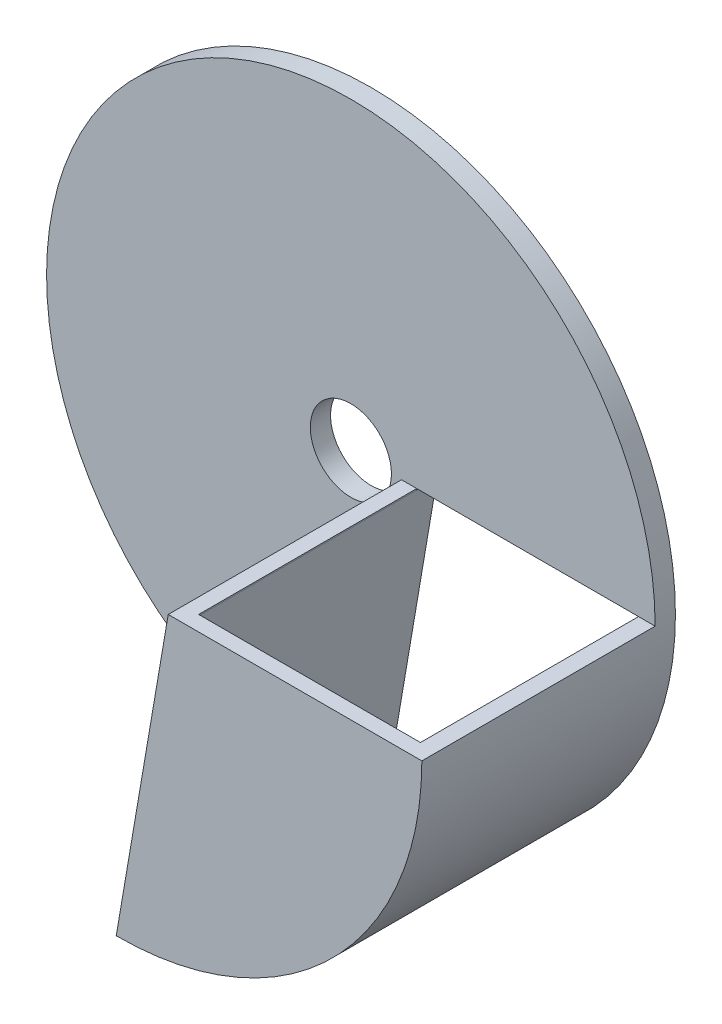
ISO-10303-21;
HEADER;
FILE_DESCRIPTION(('STEP AP214'),'2;1');
FILE_NAME('part.step','',(''),(''),'','','');
FILE_SCHEMA(('AUTOMOTIVE_DESIGN { 1 0 10303 214 1 1 1 1 }'));
ENDSEC;
DATA;
#1=APPLICATION_CONTEXT('core data for automotive mechanical design processes');
#2=APPLICATION_PROTOCOL_DEFINITION('international standard','automotive_design',2000,#1);
#3=PRODUCT_CONTEXT('',#1,'mechanical');
#4=PRODUCT('Part','Part','',(#3));
#5=PRODUCT_RELATED_PRODUCT_CATEGORY('part','',(#4));
#6=PRODUCT_DEFINITION_FORMATION('','',#4);
#7=PRODUCT_DEFINITION_CONTEXT('part definition',#1,'design');
#8=PRODUCT_DEFINITION('design','',#6,#7);
#9=PRODUCT_DEFINITION_SHAPE('','',#8);
#10=(LENGTH_UNIT() NAMED_UNIT(*) SI_UNIT(.MILLI.,.METRE.));
#11=(NAMED_UNIT(*) PLANE_ANGLE_UNIT() SI_UNIT($,.RADIAN.));
#12=(NAMED_UNIT(*) SI_UNIT($,.STERADIAN.) SOLID_ANGLE_UNIT());
#13=UNCERTAINTY_MEASURE_WITH_UNIT(LENGTH_MEASURE(1.E-05),#10,'distance_accuracy_value','');
#14=(GEOMETRIC_REPRESENTATION_CONTEXT(3) GLOBAL_UNCERTAINTY_ASSIGNED_CONTEXT((#13)) GLOBAL_UNIT_ASSIGNED_CONTEXT((#10,
#11,#12)) REPRESENTATION_CONTEXT('',''));
#15=CARTESIAN_POINT('',(0.,0.,0.));
#16=DIRECTION('',(0.,0.,1.));
#17=DIRECTION('',(1.,0.,0.));
#18=AXIS2_PLACEMENT_3D('',#15,#16,#17);
#19=CARTESIAN_POINT('',(60.,0.,50.));
#20=DIRECTION('',(0.,-1.,0.));
#21=DIRECTION('',(1.,0.,0.));
#22=AXIS2_PLACEMENT_3D('',#19,#20,#21);
#23=PLANE('',#22);
#24=DIRECTION('',(-1.,0.,0.));
#25=VECTOR('',#24,1.);
#26=CARTESIAN_POINT('',(0.,0.,4.));
#27=LINE('',#26,#25);
#28=CARTESIAN_POINT('',(60.,0.,4.));
#29=VERTEX_POINT('',#28);
#30=CARTESIAN_POINT('',(56.7219328544349,0.,4.));
#31=VERTEX_POINT('',#30);
#32=EDGE_CURVE('E204',#29,#31,#27,.T.);
#33=ORIENTED_EDGE('',*,*,#32,.T.);
#34=DIRECTION('',(0.,0.,-1.));
#35=VECTOR('',#34,1.);
#36=CARTESIAN_POINT('',(56.7219328544349,0.,47.));
#37=LINE('',#36,#35);
#38=CARTESIAN_POINT('',(56.7219328544349,0.,47.));
#39=VERTEX_POINT('',#38);
#40=EDGE_CURVE('E130',#39,#31,#37,.T.);
#41=ORIENTED_EDGE('',*,*,#40,.F.);
#42=DIRECTION('',(-1.,0.,0.));
#43=VECTOR('',#42,1.);
#44=CARTESIAN_POINT('',(0.,0.,47.));
#45=LINE('',#44,#43);
#46=CARTESIAN_POINT('',(12.9908595750254,0.,47.));
#47=VERTEX_POINT('',#46);
#48=EDGE_CURVE('E170',#39,#47,#45,.T.);
#49=ORIENTED_EDGE('',*,*,#48,.T.);
#50=DIRECTION('',(0.,0.,-1.));
#51=VECTOR('',#50,1.);
#52=CARTESIAN_POINT('',(12.9908595750254,0.,47.));
#53=LINE('',#52,#51);
#54=CARTESIAN_POINT('',(12.9908595750254,0.,4.));
#55=VERTEX_POINT('',#54);
#56=EDGE_CURVE('E142',#47,#55,#53,.T.);
#57=ORIENTED_EDGE('',*,*,#56,.T.);
#58=CARTESIAN_POINT('',(9.99085957502538,0.,4.));
#59=VERTEX_POINT('',#58);
#60=EDGE_CURVE('E208',#55,#59,#27,.T.);
#61=ORIENTED_EDGE('',*,*,#60,.T.);
#62=DIRECTION('',(0.,0.,-1.));
#63=VECTOR('',#62,1.);
#64=CARTESIAN_POINT('',(9.99085957502538,0.,50.));
#65=LINE('',#64,#63);
#66=CARTESIAN_POINT('',(9.99085957502538,0.,50.));
#67=VERTEX_POINT('',#66);
#68=EDGE_CURVE('E200',#67,#59,#65,.T.);
#69=ORIENTED_EDGE('',*,*,#68,.F.);
#70=DIRECTION('',(-1.,0.,0.));
#71=VECTOR('',#70,1.);
#72=CARTESIAN_POINT('',(60.,0.,50.));
#73=LINE('',#72,#71);
#74=CARTESIAN_POINT('',(60.,0.,50.));
#75=VERTEX_POINT('',#74);
#76=EDGE_CURVE('E187',#75,#67,#73,.T.);
#77=ORIENTED_EDGE('',*,*,#76,.F.);
#78=DIRECTION('',(0.,0.,-1.));
#79=VECTOR('',#78,1.);
#80=CARTESIAN_POINT('',(60.,0.,50.));
#81=LINE('',#80,#79);
#82=EDGE_CURVE('E194',#75,#29,#81,.T.);
#83=ORIENTED_EDGE('',*,*,#82,.T.);
#84=EDGE_LOOP('',(#33,#41,#49,#57,#61,#69,#77,#83));
#85=FACE_BOUND('',#84,.T.);
#86=ADVANCED_FACE('F39',(#85),#23,.F.);
#87=CARTESIAN_POINT('',(12.6645065777973,-2.16422529244381,47.));
#88=DIRECTION('',(0.985710687117101,-0.16844714691301,0.));
#89=DIRECTION('',(0.16844714691301,0.985710687117101,0.));
#90=AXIS2_PLACEMENT_3D('',#87,#88,#89);
#91=PLANE('',#90);
#92=DIRECTION('',(0.16844714691301,0.985710687117101,0.));
#93=VECTOR('',#92,1.);
#94=CARTESIAN_POINT('',(12.6645065777973,-2.16422529244381,4.));
#95=LINE('',#94,#93);
#96=CARTESIAN_POINT('',(12.9908595750254,-0.254488956532123,4.));
#97=VERTEX_POINT('',#96);
#98=CARTESIAN_POINT('',(13.0343489469161,0.,4.));
#99=VERTEX_POINT('',#98);
#100=EDGE_CURVE('E161',#97,#99,#95,.T.);
#101=ORIENTED_EDGE('',*,*,#100,.F.);
#102=DIRECTION('',(0.,0.,1.));
#103=VECTOR('',#102,1.);
#104=CARTESIAN_POINT('',(12.9908595750254,-0.254488956532127,47.));
#105=LINE('',#104,#103);
#106=CARTESIAN_POINT('',(12.9908595750254,-0.254488956532127,47.));
#107=VERTEX_POINT('',#106);
#108=EDGE_CURVE('E157',#97,#107,#105,.T.);
#109=ORIENTED_EDGE('',*,*,#108,.T.);
#110=DIRECTION('',(-0.16844714691301,-0.985710687117101,0.));
#111=VECTOR('',#110,1.);
#112=CARTESIAN_POINT('',(12.6645065777973,-2.16422529244381,47.));
#113=LINE('',#112,#111);
#114=CARTESIAN_POINT('',(3.32768339956714,-56.8009856007498,47.));
#115=VERTEX_POINT('',#114);
#116=EDGE_CURVE('E164',#107,#115,#113,.T.);
#117=ORIENTED_EDGE('',*,*,#116,.T.);
#118=DIRECTION('',(0.,0.,-1.));
#119=VECTOR('',#118,1.);
#120=CARTESIAN_POINT('',(3.32768339956714,-56.8009856007498,47.));
#121=LINE('',#120,#119);
#122=CARTESIAN_POINT('',(3.32768339956714,-56.8009856007498,0.));
#123=VERTEX_POINT('',#122);
#124=EDGE_CURVE('E184',#115,#123,#121,.T.);
#125=ORIENTED_EDGE('',*,*,#124,.T.);
#126=DIRECTION('',(-0.16844714691301,-0.985710687117101,0.));
#127=VECTOR('',#126,1.);
#128=CARTESIAN_POINT('',(12.6645065777973,-2.16422529244381,0.));
#129=LINE('',#128,#127);
#130=CARTESIAN_POINT('',(13.0343489469161,0.,0.));
#131=VERTEX_POINT('',#130);
#132=EDGE_CURVE('E163',#131,#123,#129,.T.);
#133=ORIENTED_EDGE('',*,*,#132,.F.);
#134=DIRECTION('',(0.,0.,-1.));
#135=VECTOR('',#134,1.);
#136=CARTESIAN_POINT('',(13.0343489469161,0.,47.));
#137=LINE('',#136,#135);
#138=EDGE_CURVE('E172',#99,#131,#137,.T.);
#139=ORIENTED_EDGE('',*,*,#138,.F.);
#140=EDGE_LOOP('',(#101,#109,#117,#125,#133,#139));
#141=FACE_BOUND('',#140,.T.);
#142=ADVANCED_FACE('F228',(#141),#91,.T.);
#143=CARTESIAN_POINT('',(0.,0.,0.));
#144=DIRECTION('',(0.,0.,1.));
#145=DIRECTION('',(1.,0.,0.));
#146=AXIS2_PLACEMENT_3D('',#143,#144,#145);
#147=PLANE('',#146);
#148=CARTESIAN_POINT('',(0.,0.,0.));
#149=DIRECTION('',(0.,0.,1.));
#150=DIRECTION('',(1.,0.,0.));
#151=AXIS2_PLACEMENT_3D('',#148,#149,#150);
#152=CIRCLE('',#151,8.);
#153=CARTESIAN_POINT('',(8.,0.,0.));
#154=VERTEX_POINT('',#153);
#155=EDGE_CURVE('E203',#154,#154,#152,.T.);
#156=ORIENTED_EDGE('',*,*,#155,.T.);
#157=EDGE_LOOP('',(#156));
#158=FACE_BOUND('',#157,.T.);
#159=CARTESIAN_POINT('',(0.,0.,0.));
#160=DIRECTION('',(0.,0.,1.));
#161=DIRECTION('',(1.,0.,0.));
#162=AXIS2_PLACEMENT_3D('',#159,#160,#161);
#163=CIRCLE('',#162,60.);
#164=CARTESIAN_POINT('',(60.,0.,0.));
#165=VERTEX_POINT('',#164);
#166=EDGE_CURVE('E43',#165,#165,#163,.T.);
#167=ORIENTED_EDGE('',*,*,#166,.F.);
#168=EDGE_LOOP('',(#167));
#169=FACE_BOUND('',#168,.T.);
#170=ORIENTED_EDGE('',*,*,#132,.T.);
#171=CARTESIAN_POINT('',(-0.199878192961273,0.000384746482229303,0.));
#172=DIRECTION('',(0.,0.,1.));
#173=DIRECTION('',(1.,0.,0.));
#174=AXIS2_PLACEMENT_3D('',#171,#172,#173);
#175=CIRCLE('',#174,56.9108018227866);
#176=CARTESIAN_POINT('',(56.7109236285248,0.,0.));
#177=VERTEX_POINT('',#176);
#178=EDGE_CURVE('E175',#123,#177,#175,.T.);
#179=ORIENTED_EDGE('',*,*,#178,.T.);
#180=DIRECTION('',(-1.,0.,0.));
#181=VECTOR('',#180,1.);
#182=CARTESIAN_POINT('',(0.,0.,0.));
#183=LINE('',#182,#181);
#184=EDGE_CURVE('E167',#177,#131,#183,.T.);
#185=ORIENTED_EDGE('',*,*,#184,.T.);
#186=EDGE_LOOP('',(#170,#179,#185));
#187=FACE_BOUND('',#186,.T.);
#188=ADVANCED_FACE('F231',(#158,#169,#187),#147,.F.);
#189=CARTESIAN_POINT('',(0.,0.,4.));
#190=DIRECTION('',(0.,0.,1.));
#191=DIRECTION('',(1.,0.,0.));
#192=AXIS2_PLACEMENT_3D('',#189,#190,#191);
#193=PLANE('',#192);
#194=CARTESIAN_POINT('',(0.,0.,4.));
#195=DIRECTION('',(0.,0.,1.));
#196=DIRECTION('',(1.,0.,0.));
#197=AXIS2_PLACEMENT_3D('',#194,#195,#196);
#198=CIRCLE('',#197,8.);
#199=CARTESIAN_POINT('',(8.,0.,4.));
#200=VERTEX_POINT('',#199);
#201=EDGE_CURVE('E48',#200,#200,#198,.T.);
#202=ORIENTED_EDGE('',*,*,#201,.F.);
#203=EDGE_LOOP('',(#202));
#204=FACE_BOUND('',#203,.T.);
#205=ORIENTED_EDGE('',*,*,#32,.F.);
#206=CARTESIAN_POINT('',(0.,0.,4.));
#207=DIRECTION('',(0.,0.,1.));
#208=DIRECTION('',(1.,0.,0.));
#209=AXIS2_PLACEMENT_3D('',#206,#207,#208);
#210=CIRCLE('',#209,60.);
#211=CARTESIAN_POINT('',(-0.262384410320105,-59.9994262841006,4.));
#212=VERTEX_POINT('',#211);
#213=EDGE_CURVE('E11',#29,#212,#210,.T.);
#214=ORIENTED_EDGE('',*,*,#213,.T.);
#215=DIRECTION('',(-0.16844714691301,-0.985710687117101,0.));
#216=VECTOR('',#215,1.);
#217=CARTESIAN_POINT('',(9.70737451644598,-1.65888385170478,4.));
#218=LINE('',#217,#216);
#219=EDGE_CURVE('E206',#59,#212,#218,.T.);
#220=ORIENTED_EDGE('',*,*,#219,.F.);
#221=ORIENTED_EDGE('',*,*,#60,.F.);
#222=DIRECTION('',(0.,1.,0.));
#223=VECTOR('',#222,1.);
#224=CARTESIAN_POINT('',(12.9908595750254,-3.,4.));
#225=LINE('',#224,#223);
#226=EDGE_CURVE('E56',#97,#55,#225,.T.);
#227=ORIENTED_EDGE('',*,*,#226,.F.);
#228=ORIENTED_EDGE('',*,*,#100,.T.);
#229=CARTESIAN_POINT('',(56.7109236285248,0.,4.));
#230=VERTEX_POINT('',#229);
#231=EDGE_CURVE('E207',#230,#99,#27,.T.);
#232=ORIENTED_EDGE('',*,*,#231,.F.);
#233=CARTESIAN_POINT('',(-0.199878192961273,0.000384746482229303,4.));
#234=DIRECTION('',(0.,0.,-1.));
#235=DIRECTION('',(-1.,0.,0.));
#236=AXIS2_PLACEMENT_3D('',#233,#234,#235);
#237=CIRCLE('',#236,56.9108018227866);
#238=CARTESIAN_POINT('',(56.6317772068735,-2.99999999999999,4.));
#239=VERTEX_POINT('',#238);
#240=EDGE_CURVE('E136',#230,#239,#237,.T.);
#241=ORIENTED_EDGE('',*,*,#240,.T.);
#242=DIRECTION('',(-1.,0.,0.));
#243=VECTOR('',#242,1.);
#244=CARTESIAN_POINT('',(56.7219328544349,-2.99999999999999,4.));
#245=LINE('',#244,#243);
#246=CARTESIAN_POINT('',(56.7219328544349,-2.99999999999999,4.));
#247=VERTEX_POINT('',#246);
#248=EDGE_CURVE('E64',#247,#239,#245,.T.);
#249=ORIENTED_EDGE('',*,*,#248,.F.);
#250=DIRECTION('',(0.,1.,0.));
#251=VECTOR('',#250,1.);
#252=CARTESIAN_POINT('',(56.7219328544349,-2.99999999999999,4.));
#253=LINE('',#252,#251);
#254=EDGE_CURVE('E125',#247,#31,#253,.T.);
#255=ORIENTED_EDGE('',*,*,#254,.T.);
#256=EDGE_LOOP('',(#205,#214,#220,#221,#227,#228,#232,#241,#249,#255));
#257=FACE_BOUND('',#256,.T.);
#258=ADVANCED_FACE('F134',(#204,#257),#193,.T.);
#259=CARTESIAN_POINT('',(0.,0.,4.));
#260=DIRECTION('',(0.,0.,-1.));
#261=DIRECTION('',(-1.,0.,0.));
#262=AXIS2_PLACEMENT_3D('',#259,#260,#261);
#263=CYLINDRICAL_SURFACE('',#262,8.);
#264=ORIENTED_EDGE('',*,*,#201,.T.);
#265=EDGE_LOOP('',(#264));
#266=FACE_BOUND('',#265,.T.);
#267=ORIENTED_EDGE('',*,*,#155,.F.);
#268=EDGE_LOOP('',(#267));
#269=FACE_BOUND('',#268,.T.);
#270=ADVANCED_FACE('F41',(#266,#269),#263,.F.);
#271=CARTESIAN_POINT('',(0.,0.,4.));
#272=DIRECTION('',(0.,0.,-1.));
#273=DIRECTION('',(-1.,0.,0.));
#274=AXIS2_PLACEMENT_3D('',#271,#272,#273);
#275=CYLINDRICAL_SURFACE('',#274,60.);
#276=ORIENTED_EDGE('',*,*,#213,.F.);
#277=ORIENTED_EDGE('',*,*,#82,.F.);
#278=CARTESIAN_POINT('',(0.,0.,50.));
#279=DIRECTION('',(0.,0.,1.));
#280=DIRECTION('',(1.,0.,0.));
#281=AXIS2_PLACEMENT_3D('',#278,#279,#280);
#282=CIRCLE('',#281,60.);
#283=CARTESIAN_POINT('',(-0.262384410320105,-59.9994262841006,50.));
#284=VERTEX_POINT('',#283);
#285=EDGE_CURVE('E192',#284,#75,#282,.T.);
#286=ORIENTED_EDGE('',*,*,#285,.F.);
#287=DIRECTION('',(0.,0.,-1.));
#288=VECTOR('',#287,1.);
#289=CARTESIAN_POINT('',(-0.262384410320105,-59.9994262841006,50.));
#290=LINE('',#289,#288);
#291=EDGE_CURVE('E197',#284,#212,#290,.T.);
#292=ORIENTED_EDGE('',*,*,#291,.T.);
#293=EDGE_LOOP('',(#276,#277,#286,#292));
#294=FACE_BOUND('',#293,.T.);
#295=ORIENTED_EDGE('',*,*,#166,.T.);
#296=EDGE_LOOP('',(#295));
#297=FACE_BOUND('',#296,.T.);
#298=ADVANCED_FACE('F242',(#294,#297),#275,.T.);
#299=CARTESIAN_POINT('',(9.99085957502538,0.,50.));
#300=DIRECTION('',(0.985710687117101,-0.16844714691301,0.));
#301=DIRECTION('',(0.16844714691301,0.985710687117101,0.));
#302=AXIS2_PLACEMENT_3D('',#299,#300,#301);
#303=PLANE('',#302);
#304=ORIENTED_EDGE('',*,*,#219,.T.);
#305=ORIENTED_EDGE('',*,*,#291,.F.);
#306=DIRECTION('',(-0.16844714691301,-0.985710687117101,0.));
#307=VECTOR('',#306,1.);
#308=CARTESIAN_POINT('',(9.99085957502538,0.,50.));
#309=LINE('',#308,#307);
#310=EDGE_CURVE('E190',#67,#284,#309,.T.);
#311=ORIENTED_EDGE('',*,*,#310,.F.);
#312=ORIENTED_EDGE('',*,*,#68,.T.);
#313=EDGE_LOOP('',(#304,#305,#311,#312));
#314=FACE_BOUND('',#313,.T.);
#315=ADVANCED_FACE('F246',(#314),#303,.F.);
#316=CARTESIAN_POINT('',(0.,0.,50.));
#317=DIRECTION('',(0.,0.,1.));
#318=DIRECTION('',(1.,0.,0.));
#319=AXIS2_PLACEMENT_3D('',#316,#317,#318);
#320=PLANE('',#319);
#321=ORIENTED_EDGE('',*,*,#76,.T.);
#322=ORIENTED_EDGE('',*,*,#310,.T.);
#323=ORIENTED_EDGE('',*,*,#285,.T.);
#324=EDGE_LOOP('',(#321,#322,#323));
#325=FACE_BOUND('',#324,.T.);
#326=ADVANCED_FACE('F248',(#325),#320,.T.);
#327=CARTESIAN_POINT('',(-0.199878192961273,0.000384746482229303,47.));
#328=DIRECTION('',(0.,0.,-1.));
#329=DIRECTION('',(-1.,0.,0.));
#330=AXIS2_PLACEMENT_3D('',#327,#328,#329);
#331=CYLINDRICAL_SURFACE('',#330,56.9108018227866);
#332=ORIENTED_EDGE('',*,*,#240,.F.);
#333=DIRECTION('',(0.,0.,-1.));
#334=VECTOR('',#333,1.);
#335=CARTESIAN_POINT('',(56.7109236285248,0.,47.));
#336=LINE('',#335,#334);
#337=EDGE_CURVE('E182',#230,#177,#336,.T.);
#338=ORIENTED_EDGE('',*,*,#337,.T.);
#339=ORIENTED_EDGE('',*,*,#178,.F.);
#340=ORIENTED_EDGE('',*,*,#124,.F.);
#341=CARTESIAN_POINT('',(-0.199878192961273,0.000384746482229303,47.));
#342=DIRECTION('',(0.,0.,1.));
#343=DIRECTION('',(1.,0.,0.));
#344=AXIS2_PLACEMENT_3D('',#341,#342,#343);
#345=CIRCLE('',#344,56.9108018227866);
#346=CARTESIAN_POINT('',(56.6317772068735,-2.99999999999999,47.));
#347=VERTEX_POINT('',#346);
#348=EDGE_CURVE('E166',#115,#347,#345,.T.);
#349=ORIENTED_EDGE('',*,*,#348,.T.);
#350=DIRECTION('',(0.,0.,-1.));
#351=VECTOR('',#350,1.);
#352=CARTESIAN_POINT('',(56.6317772068735,-2.99999999999999,47.));
#353=LINE('',#352,#351);
#354=EDGE_CURVE('E151',#347,#239,#353,.T.);
#355=ORIENTED_EDGE('',*,*,#354,.T.);
#356=EDGE_LOOP('',(#332,#338,#339,#340,#349,#355));
#357=FACE_BOUND('',#356,.T.);
#358=ADVANCED_FACE('F233',(#357),#331,.F.);
#359=CARTESIAN_POINT('',(0.,0.,47.));
#360=DIRECTION('',(0.,-1.,0.));
#361=DIRECTION('',(1.,0.,0.));
#362=AXIS2_PLACEMENT_3D('',#359,#360,#361);
#363=PLANE('',#362);
#364=ORIENTED_EDGE('',*,*,#138,.T.);
#365=ORIENTED_EDGE('',*,*,#184,.F.);
#366=ORIENTED_EDGE('',*,*,#337,.F.);
#367=ORIENTED_EDGE('',*,*,#231,.T.);
#368=EDGE_LOOP('',(#364,#365,#366,#367));
#369=FACE_BOUND('',#368,.T.);
#370=ADVANCED_FACE('F224',(#369),#363,.T.);
#371=CARTESIAN_POINT('',(0.,0.,47.));
#372=DIRECTION('',(0.,0.,1.));
#373=DIRECTION('',(1.,0.,0.));
#374=AXIS2_PLACEMENT_3D('',#371,#372,#373);
#375=PLANE('',#374);
#376=ORIENTED_EDGE('',*,*,#116,.F.);
#377=DIRECTION('',(0.,1.,0.));
#378=VECTOR('',#377,1.);
#379=CARTESIAN_POINT('',(12.9908595750254,-3.,47.));
#380=LINE('',#379,#378);
#381=EDGE_CURVE('E152',#107,#47,#380,.T.);
#382=ORIENTED_EDGE('',*,*,#381,.T.);
#383=ORIENTED_EDGE('',*,*,#48,.F.);
#384=DIRECTION('',(0.,1.,0.));
#385=VECTOR('',#384,1.);
#386=CARTESIAN_POINT('',(56.7219328544349,-2.99999999999999,47.));
#387=LINE('',#386,#385);
#388=CARTESIAN_POINT('',(56.7219328544349,-2.99999999999999,47.));
#389=VERTEX_POINT('',#388);
#390=EDGE_CURVE('E149',#389,#39,#387,.T.);
#391=ORIENTED_EDGE('',*,*,#390,.F.);
#392=DIRECTION('',(-1.,0.,0.));
#393=VECTOR('',#392,1.);
#394=CARTESIAN_POINT('',(56.7219328544349,-2.99999999999999,47.));
#395=LINE('',#394,#393);
#396=EDGE_CURVE('E132',#389,#347,#395,.T.);
#397=ORIENTED_EDGE('',*,*,#396,.T.);
#398=ORIENTED_EDGE('',*,*,#348,.F.);
#399=EDGE_LOOP('',(#376,#382,#383,#391,#397,#398));
#400=FACE_BOUND('',#399,.T.);
#401=ADVANCED_FACE('F237',(#400),#375,.F.);
#402=CARTESIAN_POINT('',(0.,-3.,0.));
#403=DIRECTION('',(0.,1.,0.));
#404=DIRECTION('',(-1.,0.,0.));
#405=AXIS2_PLACEMENT_3D('',#402,#403,#404);
#406=PLANE('',#405);
#407=ORIENTED_EDGE('',*,*,#396,.F.);
#408=DIRECTION('',(0.,0.,-1.));
#409=VECTOR('',#408,1.);
#410=CARTESIAN_POINT('',(56.7219328544349,-2.99999999999999,47.));
#411=LINE('',#410,#409);
#412=EDGE_CURVE('E128',#389,#247,#411,.T.);
#413=ORIENTED_EDGE('',*,*,#412,.T.);
#414=ORIENTED_EDGE('',*,*,#248,.T.);
#415=ORIENTED_EDGE('',*,*,#354,.F.);
#416=EDGE_LOOP('',(#407,#413,#414,#415));
#417=FACE_BOUND('',#416,.T.);
#418=ADVANCED_FACE('F140',(#417),#406,.T.);
#419=CARTESIAN_POINT('',(56.7219328544349,-2.99999999999999,47.));
#420=DIRECTION('',(1.,0.,0.));
#421=DIRECTION('',(0.,1.,0.));
#422=AXIS2_PLACEMENT_3D('',#419,#420,#421);
#423=PLANE('',#422);
#424=ORIENTED_EDGE('',*,*,#40,.T.);
#425=ORIENTED_EDGE('',*,*,#254,.F.);
#426=ORIENTED_EDGE('',*,*,#412,.F.);
#427=ORIENTED_EDGE('',*,*,#390,.T.);
#428=EDGE_LOOP('',(#424,#425,#426,#427));
#429=FACE_BOUND('',#428,.T.);
#430=ADVANCED_FACE('F126',(#429),#423,.F.);
#431=CARTESIAN_POINT('',(12.9908595750254,-3.,47.));
#432=DIRECTION('',(1.,0.,0.));
#433=DIRECTION('',(0.,1.,0.));
#434=AXIS2_PLACEMENT_3D('',#431,#432,#433);
#435=PLANE('',#434);
#436=ORIENTED_EDGE('',*,*,#226,.T.);
#437=ORIENTED_EDGE('',*,*,#56,.F.);
#438=ORIENTED_EDGE('',*,*,#381,.F.);
#439=ORIENTED_EDGE('',*,*,#108,.F.);
#440=EDGE_LOOP('',(#436,#437,#438,#439));
#441=FACE_BOUND('',#440,.T.);
#442=ADVANCED_FACE('F339',(#441),#435,.T.);
#443=CLOSED_SHELL('',(#86,#142,#188,#258,#270,#298,#315,#326,#358,#370,#401,#418,#430,#442));
#444=MANIFOLD_SOLID_BREP('B2',#443);
#445=ADVANCED_BREP_SHAPE_REPRESENTATION('',(#18,#444),#14);
#446=SHAPE_DEFINITION_REPRESENTATION(#9,#445);
ENDSEC;
END-ISO-10303-21;
